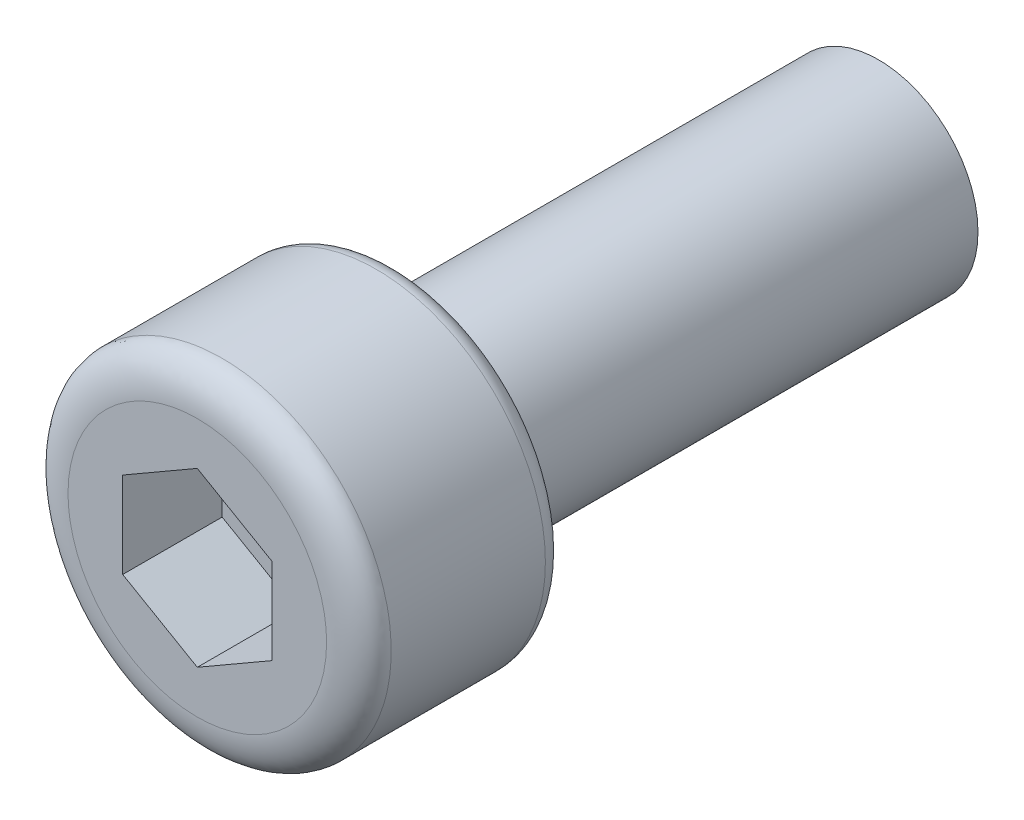
ISO-10303-21;
HEADER;
FILE_DESCRIPTION(('STEP AP214'),'2;1');
FILE_NAME('part.step','',(''),(''),'','','');
FILE_SCHEMA(('AUTOMOTIVE_DESIGN { 1 0 10303 214 1 1 1 1 }'));
ENDSEC;
DATA;
#1=APPLICATION_CONTEXT('core data for automotive mechanical design processes');
#2=APPLICATION_PROTOCOL_DEFINITION('international standard','automotive_design',2000,#1);
#3=PRODUCT_CONTEXT('',#1,'mechanical');
#4=PRODUCT('Part','Part','',(#3));
#5=PRODUCT_RELATED_PRODUCT_CATEGORY('part','',(#4));
#6=PRODUCT_DEFINITION_FORMATION('','',#4);
#7=PRODUCT_DEFINITION_CONTEXT('part definition',#1,'design');
#8=PRODUCT_DEFINITION('design','',#6,#7);
#9=PRODUCT_DEFINITION_SHAPE('','',#8);
#10=(LENGTH_UNIT() NAMED_UNIT(*) SI_UNIT(.MILLI.,.METRE.));
#11=(NAMED_UNIT(*) PLANE_ANGLE_UNIT() SI_UNIT($,.RADIAN.));
#12=(NAMED_UNIT(*) SI_UNIT($,.STERADIAN.) SOLID_ANGLE_UNIT());
#13=UNCERTAINTY_MEASURE_WITH_UNIT(LENGTH_MEASURE(1.E-05),#10,'distance_accuracy_value','');
#14=(GEOMETRIC_REPRESENTATION_CONTEXT(3) GLOBAL_UNCERTAINTY_ASSIGNED_CONTEXT((#13)) GLOBAL_UNIT_ASSIGNED_CONTEXT((#10,
#11,#12)) REPRESENTATION_CONTEXT('',''));
#15=CARTESIAN_POINT('',(0.,0.,0.));
#16=DIRECTION('',(0.,0.,1.));
#17=DIRECTION('',(1.,0.,0.));
#18=AXIS2_PLACEMENT_3D('',#15,#16,#17);
#19=CARTESIAN_POINT('',(0.,0.,7.));
#20=DIRECTION('',(0.,0.,1.));
#21=DIRECTION('',(1.,0.,0.));
#22=AXIS2_PLACEMENT_3D('',#19,#20,#21);
#23=PLANE('',#22);
#24=DIRECTION('',(-0.866025403784439,0.5,0.));
#25=VECTOR('',#24,1.);
#26=CARTESIAN_POINT('',(1.5,0.86602540378444,7.));
#27=LINE('',#26,#25);
#28=CARTESIAN_POINT('',(1.5,0.86602540378444,7.));
#29=VERTEX_POINT('',#28);
#30=CARTESIAN_POINT('',(0.,1.73205080756888,7.));
#31=VERTEX_POINT('',#30);
#32=EDGE_CURVE('E67',#29,#31,#27,.T.);
#33=ORIENTED_EDGE('',*,*,#32,.F.);
#34=DIRECTION('',(0.,1.,0.));
#35=VECTOR('',#34,1.);
#36=CARTESIAN_POINT('',(1.5,-0.866025403784439,7.));
#37=LINE('',#36,#35);
#38=CARTESIAN_POINT('',(1.5,-0.866025403784439,7.));
#39=VERTEX_POINT('',#38);
#40=EDGE_CURVE('E150',#39,#29,#37,.T.);
#41=ORIENTED_EDGE('',*,*,#40,.F.);
#42=DIRECTION('',(0.866025403784439,0.5,0.));
#43=VECTOR('',#42,1.);
#44=CARTESIAN_POINT('',(0.,-1.73205080756888,7.));
#45=LINE('',#44,#43);
#46=CARTESIAN_POINT('',(0.,-1.73205080756888,7.));
#47=VERTEX_POINT('',#46);
#48=EDGE_CURVE('E148',#47,#39,#45,.T.);
#49=ORIENTED_EDGE('',*,*,#48,.F.);
#50=DIRECTION('',(0.866025403784438,-0.5,0.));
#51=VECTOR('',#50,1.);
#52=CARTESIAN_POINT('',(-1.5,-0.866025403784438,7.));
#53=LINE('',#52,#51);
#54=CARTESIAN_POINT('',(-1.5,-0.866025403784438,7.));
#55=VERTEX_POINT('',#54);
#56=EDGE_CURVE('E115',#55,#47,#53,.T.);
#57=ORIENTED_EDGE('',*,*,#56,.F.);
#58=DIRECTION('',(0.,-1.,0.));
#59=VECTOR('',#58,1.);
#60=CARTESIAN_POINT('',(-1.5,0.866025403784439,7.));
#61=LINE('',#60,#59);
#62=CARTESIAN_POINT('',(-1.5,0.866025403784439,7.));
#63=VERTEX_POINT('',#62);
#64=EDGE_CURVE('E144',#63,#55,#61,.T.);
#65=ORIENTED_EDGE('',*,*,#64,.F.);
#66=DIRECTION('',(-0.866025403784439,-0.5,0.));
#67=VECTOR('',#66,1.);
#68=CARTESIAN_POINT('',(0.,1.73205080756888,7.));
#69=LINE('',#68,#67);
#70=EDGE_CURVE('E141',#31,#63,#69,.T.);
#71=ORIENTED_EDGE('',*,*,#70,.F.);
#72=EDGE_LOOP('',(#33,#41,#49,#57,#65,#71));
#73=FACE_BOUND('',#72,.T.);
#74=CARTESIAN_POINT('',(-2.6,0.,7.));
#75=CARTESIAN_POINT('',(-2.6,0.340339195747887,7.));
#76=CARTESIAN_POINT('',(-2.53232895612653,0.680544507086419,7.));
#77=CARTESIAN_POINT('',(-2.27184461293216,1.30940934121205,7.));
#78=CARTESIAN_POINT('',(-2.07913378430198,1.59782147786811,7.));
#79=CARTESIAN_POINT('',(-1.59782147786807,2.07913378430194,7.));
#80=CARTESIAN_POINT('',(-1.30940934121205,2.27184461293216,7.));
#81=CARTESIAN_POINT('',(-0.680544507086415,2.53232895612653,7.));
#82=CARTESIAN_POINT('',(-0.340339195747888,2.6,7.));
#83=CARTESIAN_POINT('',(0.340339195747889,2.6,7.));
#84=CARTESIAN_POINT('',(0.680544507086413,2.53232895612653,7.));
#85=CARTESIAN_POINT('',(1.30940934121205,2.27184461293216,7.));
#86=CARTESIAN_POINT('',(1.59782147786806,2.07913378430191,7.));
#87=CARTESIAN_POINT('',(2.07913378430199,1.59782147786814,7.));
#88=CARTESIAN_POINT('',(2.27184461293214,1.30940934121206,7.));
#89=CARTESIAN_POINT('',(2.53232895612655,0.680544507086404,7.));
#90=CARTESIAN_POINT('',(2.6,0.340339195748112,7.));
#91=CARTESIAN_POINT('',(2.6,-0.340339195748116,7.));
#92=CARTESIAN_POINT('',(2.53232895612663,-0.680544507086149,7.));
#93=CARTESIAN_POINT('',(2.27184461293207,-1.30940934121232,7.));
#94=CARTESIAN_POINT('',(2.07913378430184,-1.59782147786829,7.));
#95=CARTESIAN_POINT('',(1.59782147786821,-2.07913378430176,7.));
#96=CARTESIAN_POINT('',(1.30940934121224,-2.27184461293209,7.));
#97=CARTESIAN_POINT('',(0.68054450708623,-2.53232895612661,7.));
#98=CARTESIAN_POINT('',(0.340339195748087,-2.6,7.));
#99=CARTESIAN_POINT('',(-0.340339195748083,-2.6,7.));
#100=CARTESIAN_POINT('',(-0.680544507086233,-2.53232895612661,7.));
#101=CARTESIAN_POINT('',(-1.30940934121224,-2.27184461293209,7.));
#102=CARTESIAN_POINT('',(-1.59782147786814,-2.07913378430198,7.));
#103=CARTESIAN_POINT('',(-2.0791337843019,-1.59782147786808,7.));
#104=CARTESIAN_POINT('',(-2.27184461293223,-1.30940934121205,7.));
#105=CARTESIAN_POINT('',(-2.53232895612646,-0.680544507086415,7.));
#106=CARTESIAN_POINT('',(-2.6,-0.34033919574789,7.));
#107=CARTESIAN_POINT('',(-2.6,0.,7.));
#108=(BOUNDED_CURVE() B_SPLINE_CURVE(3,(#74,#75,#76,#77,#78,#79,#80,#81,#82,#83,#84,#85,#86,#87,
#88,#89,#90,#91,#92,#93,#94,#95,#96,#97,#98,#99,#100,#101,#102,#103,#104,#105,#106,#107),
.UNSPECIFIED.,.T.,.F.) B_SPLINE_CURVE_WITH_KNOTS((4,2,2,2,2,2,2,2,2,2,2,2,2,2,2,2,4),
(-3.14159265358979,-2.74889357189107,-2.35619449019234,-1.96349540849362,-1.5707963267949,
-1.17809724509617,-0.785398163397448,-0.392699081698724,0.,0.392699081698724,0.785398163397448,
1.17809724509617,1.5707963267949,1.96349540849362,2.35619449019234,2.74889357189107,
3.14159265358979),
.UNSPECIFIED.) CURVE() GEOMETRIC_REPRESENTATION_ITEM() RATIONAL_B_SPLINE_CURVE((1.,1.,1.,1.,1.,
1.,1.,1.,1.,1.,1.,1.,1.,1.,1.,1.,1.,1.,1.,1.,1.,1.,1.,1.,1.,1.,1.,1.,1.,1.,1.,1.,1.,1.)) REPRESENTATION_ITEM(''));
#109=CARTESIAN_POINT('',(-2.6,0.,7.));
#110=VERTEX_POINT('',#109);
#111=EDGE_CURVE('E13',#110,#110,#108,.F.);
#112=ORIENTED_EDGE('',*,*,#111,.T.);
#113=EDGE_LOOP('',(#112));
#114=FACE_BOUND('',#113,.T.);
#115=ADVANCED_FACE('F46',(#73,#114),#23,.T.);
#116=CARTESIAN_POINT('',(0.,0.,-7.));
#117=DIRECTION('',(0.,0.,-1.));
#118=DIRECTION('',(-1.,0.,0.));
#119=AXIS2_PLACEMENT_3D('',#116,#117,#118);
#120=CYLINDRICAL_SURFACE('',#119,3.4);
#121=CARTESIAN_POINT('',(-3.4,0.,6.5));
#122=CARTESIAN_POINT('',(-3.4,-0.445058948285702,6.5));
#123=CARTESIAN_POINT('',(-3.31150709647312,-0.889942816959202,6.5));
#124=CARTESIAN_POINT('',(-2.97087372460363,-1.7123045231234,6.5));
#125=CARTESIAN_POINT('',(-2.71886725639486,-2.08945885567367,6.5));
#126=CARTESIAN_POINT('',(-2.08945885567366,-2.71886725639486,6.5));
#127=CARTESIAN_POINT('',(-1.71230452312369,-2.97087372460351,6.5));
#128=CARTESIAN_POINT('',(-0.889942816958928,-3.31150709647324,6.5));
#129=CARTESIAN_POINT('',(-0.445058948285955,-3.4,6.5));
#130=CARTESIAN_POINT('',(0.445058948285959,-3.4,6.5));
#131=CARTESIAN_POINT('',(0.889942816958924,-3.31150709647324,6.5));
#132=CARTESIAN_POINT('',(1.71230452312369,-2.97087372460352,6.5));
#133=CARTESIAN_POINT('',(2.08945885567389,-2.71886725639464,6.5));
#134=CARTESIAN_POINT('',(2.71886725639464,-2.08945885567388,6.5));
#135=CARTESIAN_POINT('',(2.97087372460348,-1.71230452312378,6.5));
#136=CARTESIAN_POINT('',(3.31150709647328,-0.889942816958834,6.5));
#137=CARTESIAN_POINT('',(3.4,-0.445058948285998,6.5));
#138=CARTESIAN_POINT('',(3.4,0.445058948285994,6.5));
#139=CARTESIAN_POINT('',(3.31150709647316,0.889942816959108,6.5));
#140=CARTESIAN_POINT('',(2.97087372460359,1.7123045231235,6.5));
#141=CARTESIAN_POINT('',(2.71886725639482,2.0894588556737,6.5));
#142=CARTESIAN_POINT('',(2.0894588556737,2.71886725639482,6.5));
#143=CARTESIAN_POINT('',(1.71230452312347,2.9708737246036,6.5));
#144=CARTESIAN_POINT('',(0.889942816959137,3.31150709647315,6.5));
#145=CARTESIAN_POINT('',(0.4450589482857,3.4,6.5));
#146=CARTESIAN_POINT('',(-0.4450589482857,3.4,6.5));
#147=CARTESIAN_POINT('',(-0.889942816959166,3.31150709647314,6.5));
#148=CARTESIAN_POINT('',(-1.71230452312345,2.97087372460361,6.5));
#149=CARTESIAN_POINT('',(-2.08945885567363,2.71886725639489,6.5));
#150=CARTESIAN_POINT('',(-2.7188672563949,2.08945885567362,6.5));
#151=CARTESIAN_POINT('',(-2.9708737246036,1.71230452312347,6.5));
#152=CARTESIAN_POINT('',(-3.31150709647314,0.88994281695915,6.5));
#153=CARTESIAN_POINT('',(-3.4,0.445058948285699,6.5));
#154=CARTESIAN_POINT('',(-3.4,0.,6.5));
#155=(BOUNDED_CURVE() B_SPLINE_CURVE(3,(#121,#122,#123,#124,#125,#126,#127,#128,#129,#130,#131,
#132,#133,#134,#135,#136,#137,#138,#139,#140,#141,#142,#143,#144,#145,#146,#147,#148,#149,#150,
#151,#152,#153,#154),.UNSPECIFIED.,.T.,.F.) B_SPLINE_CURVE_WITH_KNOTS((4,2,2,2,2,2,2,2,2,2,2,2,
2,2,2,2,4),(-3.14159265358979,-2.74889357189107,-2.35619449019234,-1.96349540849362,
-1.5707963267949,-1.17809724509617,-0.785398163397448,-0.392699081698724,0.,0.392699081698724,
0.785398163397448,1.17809724509617,1.5707963267949,1.96349540849362,2.35619449019234,
2.74889357189107,3.14159265358979),
.UNSPECIFIED.) CURVE() GEOMETRIC_REPRESENTATION_ITEM() RATIONAL_B_SPLINE_CURVE((1.,1.,1.,1.,1.,
1.,1.,1.,1.,1.,1.,1.,1.,1.,1.,1.,1.,1.,1.,1.,1.,1.,1.,1.,1.,1.,1.,1.,1.,1.,1.,1.,1.,1.)) REPRESENTATION_ITEM(''));
#156=CARTESIAN_POINT('',(-3.4,0.,6.5));
#157=VERTEX_POINT('',#156);
#158=EDGE_CURVE('E60',#157,#157,#155,.F.);
#159=ORIENTED_EDGE('',*,*,#158,.T.);
#160=EDGE_LOOP('',(#159));
#161=FACE_BOUND('',#160,.T.);
#162=CARTESIAN_POINT('',(0.,0.,3.4));
#163=DIRECTION('',(0.,0.,-1.));
#164=DIRECTION('',(-1.,0.,0.));
#165=AXIS2_PLACEMENT_3D('',#162,#163,#164);
#166=CIRCLE('',#165,3.4);
#167=CARTESIAN_POINT('',(-3.4,0.,3.4));
#168=VERTEX_POINT('',#167);
#169=EDGE_CURVE('E171',#168,#168,#166,.F.);
#170=ORIENTED_EDGE('',*,*,#169,.T.);
#171=EDGE_LOOP('',(#170));
#172=FACE_BOUND('',#171,.T.);
#173=ADVANCED_FACE('F183',(#161,#172),#120,.T.);
#174=CARTESIAN_POINT('',(0.,3.4,3.));
#175=DIRECTION('',(0.,0.,-1.));
#176=DIRECTION('',(-1.,0.,0.));
#177=AXIS2_PLACEMENT_3D('',#174,#175,#176);
#178=PLANE('',#177);
#179=CARTESIAN_POINT('',(0.,0.,3.));
#180=DIRECTION('',(0.,0.,-1.));
#181=DIRECTION('',(-1.,0.,0.));
#182=AXIS2_PLACEMENT_3D('',#179,#180,#181);
#183=CIRCLE('',#182,3.);
#184=CARTESIAN_POINT('',(-3.,0.,3.));
#185=VERTEX_POINT('',#184);
#186=EDGE_CURVE('E168',#185,#185,#183,.T.);
#187=ORIENTED_EDGE('',*,*,#186,.T.);
#188=EDGE_LOOP('',(#187));
#189=FACE_BOUND('',#188,.T.);
#190=CARTESIAN_POINT('',(0.,0.,3.));
#191=DIRECTION('',(0.,0.,-1.));
#192=DIRECTION('',(-1.,0.,0.));
#193=AXIS2_PLACEMENT_3D('',#190,#191,#192);
#194=CIRCLE('',#193,2.);
#195=CARTESIAN_POINT('',(-2.,0.,3.));
#196=VERTEX_POINT('',#195);
#197=EDGE_CURVE('E154',#196,#196,#194,.T.);
#198=ORIENTED_EDGE('',*,*,#197,.F.);
#199=EDGE_LOOP('',(#198));
#200=FACE_BOUND('',#199,.T.);
#201=ADVANCED_FACE('F193',(#189,#200),#178,.T.);
#202=CARTESIAN_POINT('',(0.,0.,-7.));
#203=DIRECTION('',(0.,0.,-1.));
#204=DIRECTION('',(-1.,0.,0.));
#205=AXIS2_PLACEMENT_3D('',#202,#203,#204);
#206=CYLINDRICAL_SURFACE('',#205,2.);
#207=CARTESIAN_POINT('',(0.,0.,-6.7));
#208=DIRECTION('',(0.,0.,-1.));
#209=DIRECTION('',(-1.,0.,0.));
#210=AXIS2_PLACEMENT_3D('',#207,#208,#209);
#211=CIRCLE('',#210,2.);
#212=CARTESIAN_POINT('',(2.,0.,-6.7));
#213=VERTEX_POINT('',#212);
#214=EDGE_CURVE('E165',#213,#213,#211,.F.);
#215=ORIENTED_EDGE('',*,*,#214,.T.);
#216=EDGE_LOOP('',(#215));
#217=FACE_BOUND('',#216,.T.);
#218=ORIENTED_EDGE('',*,*,#197,.T.);
#219=EDGE_LOOP('',(#218));
#220=FACE_BOUND('',#219,.T.);
#221=ADVANCED_FACE('F242',(#217,#220),#206,.T.);
#222=CARTESIAN_POINT('',(0.,2.,-7.));
#223=DIRECTION('',(0.,0.,-1.));
#224=DIRECTION('',(-1.,0.,0.));
#225=AXIS2_PLACEMENT_3D('',#222,#223,#224);
#226=PLANE('',#225);
#227=CARTESIAN_POINT('',(0.,0.,-7.));
#228=DIRECTION('',(0.,0.,-1.));
#229=DIRECTION('',(-1.,0.,0.));
#230=AXIS2_PLACEMENT_3D('',#227,#228,#229);
#231=CIRCLE('',#230,1.48038475772934);
#232=CARTESIAN_POINT('',(1.48038475772934,0.,-7.));
#233=VERTEX_POINT('',#232);
#234=EDGE_CURVE('E162',#233,#233,#231,.T.);
#235=ORIENTED_EDGE('',*,*,#234,.T.);
#236=EDGE_LOOP('',(#235));
#237=FACE_BOUND('',#236,.T.);
#238=ADVANCED_FACE('F234',(#237),#226,.T.);
#239=CARTESIAN_POINT('',(0.,0.,-7.));
#240=DIRECTION('',(0.,0.,1.));
#241=DIRECTION('',(1.,0.,0.));
#242=AXIS2_PLACEMENT_3D('',#239,#240,#241);
#243=CONICAL_SURFACE('',#242,1.48038475772934,1.0471975511966);
#244=CARTESIAN_POINT('',(2.,0.,-6.7));
#245=CARTESIAN_POINT('',(1.99458734122635,0.,-6.703125));
#246=CARTESIAN_POINT('',(1.9891746824527,0.,-6.70625));
#247=CARTESIAN_POINT('',(1.97834936490539,0.,-6.7125));
#248=CARTESIAN_POINT('',(1.97293670613174,0.,-6.715625));
#249=CARTESIAN_POINT('',(1.96211138858444,0.,-6.721875));
#250=CARTESIAN_POINT('',(1.95669872981078,0.,-6.725));
#251=CARTESIAN_POINT('',(1.94587341226348,0.,-6.73125));
#252=CARTESIAN_POINT('',(1.94046075348982,0.,-6.734375));
#253=CARTESIAN_POINT('',(1.92963543594252,0.,-6.740625));
#254=CARTESIAN_POINT('',(1.92422277716887,0.,-6.74375));
#255=CARTESIAN_POINT('',(1.91339745962156,0.,-6.75));
#256=CARTESIAN_POINT('',(1.90798480084791,0.,-6.753125));
#257=CARTESIAN_POINT('',(1.8971594833006,0.,-6.759375));
#258=CARTESIAN_POINT('',(1.89174682452695,0.,-6.7625));
#259=CARTESIAN_POINT('',(1.88092150697964,0.,-6.76875));
#260=CARTESIAN_POINT('',(1.87550884820599,0.,-6.771875));
#261=CARTESIAN_POINT('',(1.86468353065869,0.,-6.778125));
#262=CARTESIAN_POINT('',(1.85927087188503,0.,-6.78125));
#263=CARTESIAN_POINT('',(1.84844555433773,0.,-6.7875));
#264=CARTESIAN_POINT('',(1.84303289556407,0.,-6.790625));
#265=CARTESIAN_POINT('',(1.83220757801677,0.,-6.796875));
#266=CARTESIAN_POINT('',(1.82679491924312,0.,-6.8));
#267=CARTESIAN_POINT('',(1.81596960169581,0.,-6.80625));
#268=CARTESIAN_POINT('',(1.81055694292216,0.,-6.809375));
#269=CARTESIAN_POINT('',(1.79973162537485,0.,-6.815625));
#270=CARTESIAN_POINT('',(1.7943189666012,0.,-6.81875));
#271=CARTESIAN_POINT('',(1.78349364905389,0.,-6.825));
#272=CARTESIAN_POINT('',(1.77808099028024,0.,-6.828125));
#273=CARTESIAN_POINT('',(1.76725567273294,0.,-6.834375));
#274=CARTESIAN_POINT('',(1.76184301395928,0.,-6.8375));
#275=CARTESIAN_POINT('',(1.75101769641198,0.,-6.84375));
#276=CARTESIAN_POINT('',(1.74560503763833,0.,-6.846875));
#277=CARTESIAN_POINT('',(1.73477972009102,0.,-6.853125));
#278=CARTESIAN_POINT('',(1.72936706131737,0.,-6.85625));
#279=CARTESIAN_POINT('',(1.71854174377006,0.,-6.8625));
#280=CARTESIAN_POINT('',(1.71312908499641,0.,-6.865625));
#281=CARTESIAN_POINT('',(1.7023037674491,0.,-6.871875));
#282=CARTESIAN_POINT('',(1.69689110867545,0.,-6.875));
#283=CARTESIAN_POINT('',(1.68606579112815,0.,-6.88125));
#284=CARTESIAN_POINT('',(1.68065313235449,0.,-6.884375));
#285=CARTESIAN_POINT('',(1.66982781480719,0.,-6.890625));
#286=CARTESIAN_POINT('',(1.66441515603353,0.,-6.89375));
#287=CARTESIAN_POINT('',(1.65358983848623,0.,-6.9));
#288=CARTESIAN_POINT('',(1.64817717971258,0.,-6.903125));
#289=CARTESIAN_POINT('',(1.63735186216527,0.,-6.909375));
#290=CARTESIAN_POINT('',(1.63193920339162,0.,-6.9125));
#291=CARTESIAN_POINT('',(1.62111388584431,0.,-6.91875));
#292=CARTESIAN_POINT('',(1.61570122707066,0.,-6.921875));
#293=CARTESIAN_POINT('',(1.60487590952335,0.,-6.928125));
#294=CARTESIAN_POINT('',(1.5994632507497,0.,-6.93125));
#295=CARTESIAN_POINT('',(1.5886379332024,0.,-6.9375));
#296=CARTESIAN_POINT('',(1.58322527442874,0.,-6.940625));
#297=CARTESIAN_POINT('',(1.57239995688144,0.,-6.946875));
#298=CARTESIAN_POINT('',(1.56698729810779,0.,-6.95));
#299=CARTESIAN_POINT('',(1.55616198056048,0.,-6.95625));
#300=CARTESIAN_POINT('',(1.55074932178683,0.,-6.959375));
#301=CARTESIAN_POINT('',(1.53992400423952,0.,-6.965625));
#302=CARTESIAN_POINT('',(1.53451134546587,0.,-6.96875));
#303=CARTESIAN_POINT('',(1.52368602791856,0.,-6.975));
#304=CARTESIAN_POINT('',(1.51827336914491,0.,-6.978125));
#305=CARTESIAN_POINT('',(1.5074480515976,0.,-6.984375));
#306=CARTESIAN_POINT('',(1.50203539282395,0.,-6.9875));
#307=CARTESIAN_POINT('',(1.49121007527665,0.,-6.99375));
#308=CARTESIAN_POINT('',(1.48579741650299,0.,-6.996875));
#309=CARTESIAN_POINT('',(1.48038475772934,0.,-7.));
#310=B_SPLINE_CURVE_WITH_KNOTS('',3,(#244,#245,#246,#247,#248,#249,#250,#251,#252,#253,#254,
#255,#256,#257,#258,#259,#260,#261,#262,#263,#264,#265,#266,#267,#268,#269,#270,#271,#272,#273,
#274,#275,#276,#277,#278,#279,#280,#281,#282,#283,#284,#285,#286,#287,#288,#289,#290,#291,#292,
#293,#294,#295,#296,#297,#298,#299,#300,#301,#302,#303,#304,#305,#306,#307,#308,#309),
.UNSPECIFIED.,.F.,.F.,(4,2,2,2,2,2,2,2,2,2,2,2,2,2,2,2,2,2,2,2,2,2,2,2,2,2,2,2,2,2,2,2,4),(0.,
0.0187500000000003,0.0374999999999998,0.0562499999999997,0.0749999999999998,0.0937500000000002,
0.1125,0.13125,0.15,0.16875,0.1875,0.20625,0.225,0.24375,0.2625,0.28125,0.3,0.31875,0.3375,
0.35625,0.375,0.39375,0.4125,0.43125,0.45,0.46875,0.4875,0.50625,0.525,0.54375,0.5625,
0.581249999999999,0.6),.UNSPECIFIED.);
#311=EDGE_CURVE('BSEAM200',#213,#233,#310,.T.);
#312=ORIENTED_EDGE('',*,*,#214,.F.);
#313=ORIENTED_EDGE('',*,*,#234,.F.);
#314=ORIENTED_EDGE('',*,*,#311,.T.);
#315=ORIENTED_EDGE('',*,*,#311,.F.);
#316=EDGE_LOOP('',(#312,#314,#313,#315));
#317=FACE_BOUND('',#316,.T.);
#318=ADVANCED_FACE('F200',(#317),#243,.T.);
#319=CARTESIAN_POINT('',(0.,0.,3.4));
#320=DIRECTION('',(0.,0.,-1.));
#321=DIRECTION('',(-1.,0.,0.));
#322=AXIS2_PLACEMENT_3D('',#319,#320,#321);
#323=TOROIDAL_SURFACE('',#322,3.,0.4);
#324=ORIENTED_EDGE('',*,*,#169,.F.);
#325=EDGE_LOOP('',(#324));
#326=FACE_BOUND('',#325,.T.);
#327=ORIENTED_EDGE('',*,*,#186,.F.);
#328=EDGE_LOOP('',(#327));
#329=FACE_BOUND('',#328,.T.);
#330=ADVANCED_FACE('F223',(#326,#329),#323,.T.);
#331=CARTESIAN_POINT('',(-2.6,0.,7.));
#332=CARTESIAN_POINT('',(-2.6,-0.34033919574789,7.));
#333=CARTESIAN_POINT('',(-2.53232895612646,-0.680544507086415,7.));
#334=CARTESIAN_POINT('',(-2.27184461293223,-1.30940934121205,7.));
#335=CARTESIAN_POINT('',(-2.0791337843019,-1.59782147786808,7.));
#336=CARTESIAN_POINT('',(-1.59782147786814,-2.07913378430198,7.));
#337=CARTESIAN_POINT('',(-1.30940934121224,-2.27184461293209,7.));
#338=CARTESIAN_POINT('',(-0.680544507086233,-2.53232895612661,7.));
#339=CARTESIAN_POINT('',(-0.340339195748083,-2.6,7.));
#340=CARTESIAN_POINT('',(0.340339195748087,-2.6,7.));
#341=CARTESIAN_POINT('',(0.68054450708623,-2.53232895612661,7.));
#342=CARTESIAN_POINT('',(1.30940934121224,-2.27184461293209,7.));
#343=CARTESIAN_POINT('',(1.59782147786821,-2.07913378430176,7.));
#344=CARTESIAN_POINT('',(2.07913378430184,-1.59782147786829,7.));
#345=CARTESIAN_POINT('',(2.27184461293207,-1.30940934121232,7.));
#346=CARTESIAN_POINT('',(2.53232895612663,-0.680544507086149,7.));
#347=CARTESIAN_POINT('',(2.6,-0.340339195748116,7.));
#348=CARTESIAN_POINT('',(2.6,0.340339195748112,7.));
#349=CARTESIAN_POINT('',(2.53232895612655,0.680544507086404,7.));
#350=CARTESIAN_POINT('',(2.27184461293214,1.30940934121206,7.));
#351=CARTESIAN_POINT('',(2.07913378430199,1.59782147786814,7.));
#352=CARTESIAN_POINT('',(1.59782147786806,2.07913378430191,7.));
#353=CARTESIAN_POINT('',(1.30940934121205,2.27184461293216,7.));
#354=CARTESIAN_POINT('',(0.680544507086413,2.53232895612653,7.));
#355=CARTESIAN_POINT('',(0.340339195747889,2.6,7.));
#356=CARTESIAN_POINT('',(-0.340339195747888,2.6,7.));
#357=CARTESIAN_POINT('',(-0.680544507086415,2.53232895612653,7.));
#358=CARTESIAN_POINT('',(-1.30940934121205,2.27184461293216,7.));
#359=CARTESIAN_POINT('',(-1.59782147786807,2.07913378430194,7.));
#360=CARTESIAN_POINT('',(-2.07913378430198,1.59782147786811,7.));
#361=CARTESIAN_POINT('',(-2.27184461293216,1.30940934121205,7.));
#362=CARTESIAN_POINT('',(-2.53232895612653,0.680544507086419,7.));
#363=CARTESIAN_POINT('',(-2.6,0.340339195747887,7.));
#364=CARTESIAN_POINT('',(-2.6,0.,7.));
#365=CARTESIAN_POINT('',(-3.4,0.,7.));
#366=CARTESIAN_POINT('',(-3.4,-0.445058948285702,7.));
#367=CARTESIAN_POINT('',(-3.31150709647311,-0.889942816959197,7.));
#368=CARTESIAN_POINT('',(-2.97087372460364,-1.71230452312341,7.));
#369=CARTESIAN_POINT('',(-2.71886725639478,-2.0894588556736,7.));
#370=CARTESIAN_POINT('',(-2.08945885567374,-2.71886725639494,7.));
#371=CARTESIAN_POINT('',(-1.7123045231237,-2.97087372460352,7.));
#372=CARTESIAN_POINT('',(-0.889942816958926,-3.31150709647323,7.));
#373=CARTESIAN_POINT('',(-0.445058948285955,-3.4,7.));
#374=CARTESIAN_POINT('',(0.445058948285959,-3.4,7.));
#375=CARTESIAN_POINT('',(0.889942816958922,-3.31150709647324,7.));
#376=CARTESIAN_POINT('',(1.71230452312369,-2.97087372460352,7.));
#377=CARTESIAN_POINT('',(2.08945885567385,-2.7188672563946,7.));
#378=CARTESIAN_POINT('',(2.71886725639468,-2.08945885567392,7.));
#379=CARTESIAN_POINT('',(2.9708737246035,-1.71230452312379,7.));
#380=CARTESIAN_POINT('',(3.31150709647326,-0.889942816958826,7.));
#381=CARTESIAN_POINT('',(3.4,-0.445058948285998,7.));
#382=CARTESIAN_POINT('',(3.4,0.445058948285994,7.));
#383=CARTESIAN_POINT('',(3.31150709647318,0.889942816959118,7.));
#384=CARTESIAN_POINT('',(2.97087372460357,1.71230452312349,7.));
#385=CARTESIAN_POINT('',(2.71886725639475,2.0894588556737,7.));
#386=CARTESIAN_POINT('',(2.08945885567377,2.71886725639482,7.));
#387=CARTESIAN_POINT('',(1.71230452312347,2.97087372460359,7.));
#388=CARTESIAN_POINT('',(0.889942816959141,3.31150709647316,7.));
#389=CARTESIAN_POINT('',(0.4450589482857,3.4,7.));
#390=CARTESIAN_POINT('',(-0.4450589482857,3.4,7.));
#391=CARTESIAN_POINT('',(-0.889942816959144,3.31150709647308,7.));
#392=CARTESIAN_POINT('',(-1.71230452312347,2.97087372460366,7.));
#393=CARTESIAN_POINT('',(-2.08945885567367,2.71886725639493,7.));
#394=CARTESIAN_POINT('',(-2.71886725639486,2.08945885567359,7.));
#395=CARTESIAN_POINT('',(-2.97087372460357,1.71230452312345,7.));
#396=CARTESIAN_POINT('',(-3.31150709647318,0.889942816959166,7.));
#397=CARTESIAN_POINT('',(-3.4,0.445058948285699,7.));
#398=CARTESIAN_POINT('',(-3.4,0.,7.));
#399=CARTESIAN_POINT('',(-3.4,0.,6.5));
#400=CARTESIAN_POINT('',(-3.4,-0.445058948285702,6.5));
#401=CARTESIAN_POINT('',(-3.31150709647312,-0.889942816959202,6.5));
#402=CARTESIAN_POINT('',(-2.97087372460363,-1.7123045231234,6.5));
#403=CARTESIAN_POINT('',(-2.71886725639486,-2.08945885567367,6.5));
#404=CARTESIAN_POINT('',(-2.08945885567366,-2.71886725639486,6.5));
#405=CARTESIAN_POINT('',(-1.71230452312369,-2.97087372460351,6.5));
#406=CARTESIAN_POINT('',(-0.889942816958928,-3.31150709647324,6.5));
#407=CARTESIAN_POINT('',(-0.445058948285955,-3.4,6.5));
#408=CARTESIAN_POINT('',(0.445058948285959,-3.4,6.5));
#409=CARTESIAN_POINT('',(0.889942816958924,-3.31150709647324,6.5));
#410=CARTESIAN_POINT('',(1.71230452312369,-2.97087372460352,6.5));
#411=CARTESIAN_POINT('',(2.08945885567389,-2.71886725639464,6.5));
#412=CARTESIAN_POINT('',(2.71886725639464,-2.08945885567388,6.5));
#413=CARTESIAN_POINT('',(2.97087372460348,-1.71230452312378,6.5));
#414=CARTESIAN_POINT('',(3.31150709647328,-0.889942816958834,6.5));
#415=CARTESIAN_POINT('',(3.4,-0.445058948285998,6.5));
#416=CARTESIAN_POINT('',(3.4,0.445058948285994,6.5));
#417=CARTESIAN_POINT('',(3.31150709647316,0.889942816959108,6.5));
#418=CARTESIAN_POINT('',(2.97087372460359,1.7123045231235,6.5));
#419=CARTESIAN_POINT('',(2.71886725639482,2.0894588556737,6.5));
#420=CARTESIAN_POINT('',(2.0894588556737,2.71886725639482,6.5));
#421=CARTESIAN_POINT('',(1.71230452312347,2.9708737246036,6.5));
#422=CARTESIAN_POINT('',(0.889942816959137,3.31150709647315,6.5));
#423=CARTESIAN_POINT('',(0.4450589482857,3.4,6.5));
#424=CARTESIAN_POINT('',(-0.4450589482857,3.4,6.5));
#425=CARTESIAN_POINT('',(-0.889942816959166,3.31150709647314,6.5));
#426=CARTESIAN_POINT('',(-1.71230452312345,2.97087372460361,6.5));
#427=CARTESIAN_POINT('',(-2.08945885567363,2.71886725639489,6.5));
#428=CARTESIAN_POINT('',(-2.7188672563949,2.08945885567362,6.5));
#429=CARTESIAN_POINT('',(-2.9708737246036,1.71230452312347,6.5));
#430=CARTESIAN_POINT('',(-3.31150709647314,0.88994281695915,6.5));
#431=CARTESIAN_POINT('',(-3.4,0.445058948285699,6.5));
#432=CARTESIAN_POINT('',(-3.4,0.,6.5));
#433=(BOUNDED_SURFACE() B_SPLINE_SURFACE(2,3,((#331,#332,#333,#334,#335,#336,#337,#338,#339,
#340,#341,#342,#343,#344,#345,#346,#347,#348,#349,#350,#351,#352,#353,#354,#355,#356,#357,#358,
#359,#360,#361,#362,#363,#364),(#365,#366,#367,#368,#369,#370,#371,#372,#373,#374,#375,#376,
#377,#378,#379,#380,#381,#382,#383,#384,#385,#386,#387,#388,#389,#390,#391,#392,#393,#394,#395,
#396,#397,#398),(#399,#400,#401,#402,#403,#404,#405,#406,#407,#408,#409,#410,#411,#412,#413,
#414,#415,#416,#417,#418,#419,#420,#421,#422,#423,#424,#425,#426,#427,#428,#429,#430,#431,
#432)),.UNSPECIFIED.,.F.,.T.,.F.) B_SPLINE_SURFACE_WITH_KNOTS((3,3),(4,2,2,2,2,2,2,2,2,2,2,2,2,
2,2,2,4),(0.,1.),(-3.14159265358979,-2.74889357189107,-2.35619449019234,-1.96349540849362,
-1.5707963267949,-1.17809724509617,-0.785398163397448,-0.392699081698724,0.,0.392699081698724,
0.785398163397448,1.17809724509617,1.5707963267949,1.96349540849362,2.35619449019234,
2.74889357189107,3.14159265358979),
.UNSPECIFIED.) GEOMETRIC_REPRESENTATION_ITEM() RATIONAL_B_SPLINE_SURFACE(((1.,1.,1.,1.,1.,1.,1.,
1.,1.,1.,1.,1.,1.,1.,1.,1.,1.,1.,1.,1.,1.,1.,1.,1.,1.,1.,1.,1.,1.,1.,1.,1.,1.,1.),
(0.707106781186548,0.707106781186548,0.707106781186548,0.707106781186548,0.707106781186547,
0.707106781186547,0.707106781186548,0.707106781186548,0.707106781186548,0.707106781186548,
0.707106781186548,0.707106781186548,0.707106781186548,0.707106781186548,0.707106781186548,
0.707106781186548,0.707106781186548,0.707106781186548,0.707106781186548,0.707106781186548,
0.707106781186548,0.707106781186548,0.707106781186548,0.707106781186548,0.707106781186548,
0.707106781186548,0.707106781186548,0.707106781186548,0.707106781186548,0.707106781186548,
0.707106781186548,0.707106781186548,0.707106781186548,0.707106781186548),(1.,1.,1.,1.,1.,1.,1.,
1.,1.,1.,1.,1.,1.,1.,1.,1.,1.,1.,1.,1.,1.,1.,1.,1.,1.,1.,1.,1.,1.,1.,1.,1.,1.,1.))) REPRESENTATION_ITEM('') SURFACE());
#434=ORIENTED_EDGE('',*,*,#111,.F.);
#435=EDGE_LOOP('',(#434));
#436=FACE_BOUND('',#435,.T.);
#437=ORIENTED_EDGE('',*,*,#158,.F.);
#438=EDGE_LOOP('',(#437));
#439=FACE_BOUND('',#438,.T.);
#440=ADVANCED_FACE('F49',(#436,#439),#433,.T.);
#441=CARTESIAN_POINT('',(1.5,0.86602540378444,5.));
#442=DIRECTION('',(0.5,0.866025403784439,0.));
#443=DIRECTION('',(-0.866025403784439,0.5,0.));
#444=AXIS2_PLACEMENT_3D('',#441,#442,#443);
#445=PLANE('',#444);
#446=ORIENTED_EDGE('',*,*,#32,.T.);
#447=DIRECTION('',(0.,0.,1.));
#448=VECTOR('',#447,1.);
#449=CARTESIAN_POINT('',(0.,1.73205080756888,5.));
#450=LINE('',#449,#448);
#451=CARTESIAN_POINT('',(0.,1.73205080756888,5.));
#452=VERTEX_POINT('',#451);
#453=EDGE_CURVE('E97',#452,#31,#450,.T.);
#454=ORIENTED_EDGE('',*,*,#453,.F.);
#455=DIRECTION('',(-0.866025403784439,0.5,0.));
#456=VECTOR('',#455,1.);
#457=CARTESIAN_POINT('',(1.5,0.86602540378444,5.));
#458=LINE('',#457,#456);
#459=CARTESIAN_POINT('',(1.5,0.86602540378444,5.));
#460=VERTEX_POINT('',#459);
#461=EDGE_CURVE('E152',#460,#452,#458,.T.);
#462=ORIENTED_EDGE('',*,*,#461,.F.);
#463=DIRECTION('',(0.,0.,1.));
#464=VECTOR('',#463,1.);
#465=CARTESIAN_POINT('',(1.5,0.86602540378444,5.));
#466=LINE('',#465,#464);
#467=EDGE_CURVE('E75',#460,#29,#466,.T.);
#468=ORIENTED_EDGE('',*,*,#467,.T.);
#469=EDGE_LOOP('',(#446,#454,#462,#468));
#470=FACE_BOUND('',#469,.T.);
#471=ADVANCED_FACE('F222',(#470),#445,.F.);
#472=CARTESIAN_POINT('',(1.5,-0.866025403784439,5.));
#473=DIRECTION('',(1.,0.,0.));
#474=DIRECTION('',(0.,0.,-1.));
#475=AXIS2_PLACEMENT_3D('',#472,#473,#474);
#476=PLANE('',#475);
#477=ORIENTED_EDGE('',*,*,#40,.T.);
#478=ORIENTED_EDGE('',*,*,#467,.F.);
#479=DIRECTION('',(0.,1.,0.));
#480=VECTOR('',#479,1.);
#481=CARTESIAN_POINT('',(1.5,-0.866025403784439,5.));
#482=LINE('',#481,#480);
#483=CARTESIAN_POINT('',(1.5,-0.866025403784439,5.));
#484=VERTEX_POINT('',#483);
#485=EDGE_CURVE('E127',#484,#460,#482,.T.);
#486=ORIENTED_EDGE('',*,*,#485,.F.);
#487=DIRECTION('',(0.,0.,1.));
#488=VECTOR('',#487,1.);
#489=CARTESIAN_POINT('',(1.5,-0.866025403784439,5.));
#490=LINE('',#489,#488);
#491=EDGE_CURVE('E119',#484,#39,#490,.T.);
#492=ORIENTED_EDGE('',*,*,#491,.T.);
#493=EDGE_LOOP('',(#477,#478,#486,#492));
#494=FACE_BOUND('',#493,.T.);
#495=ADVANCED_FACE('F228',(#494),#476,.F.);
#496=CARTESIAN_POINT('',(0.,-1.73205080756888,5.));
#497=DIRECTION('',(0.5,-0.866025403784439,0.));
#498=DIRECTION('',(0.866025403784439,0.5,0.));
#499=AXIS2_PLACEMENT_3D('',#496,#497,#498);
#500=PLANE('',#499);
#501=ORIENTED_EDGE('',*,*,#48,.T.);
#502=ORIENTED_EDGE('',*,*,#491,.F.);
#503=DIRECTION('',(0.866025403784439,0.5,0.));
#504=VECTOR('',#503,1.);
#505=CARTESIAN_POINT('',(0.,-1.73205080756888,5.));
#506=LINE('',#505,#504);
#507=CARTESIAN_POINT('',(0.,-1.73205080756888,5.));
#508=VERTEX_POINT('',#507);
#509=EDGE_CURVE('E123',#508,#484,#506,.T.);
#510=ORIENTED_EDGE('',*,*,#509,.F.);
#511=DIRECTION('',(0.,0.,1.));
#512=VECTOR('',#511,1.);
#513=CARTESIAN_POINT('',(0.,-1.73205080756888,5.));
#514=LINE('',#513,#512);
#515=EDGE_CURVE('E108',#508,#47,#514,.T.);
#516=ORIENTED_EDGE('',*,*,#515,.T.);
#517=EDGE_LOOP('',(#501,#502,#510,#516));
#518=FACE_BOUND('',#517,.T.);
#519=ADVANCED_FACE('F124',(#518),#500,.F.);
#520=CARTESIAN_POINT('',(-1.5,-0.866025403784438,5.));
#521=DIRECTION('',(-0.5,-0.866025403784439,0.));
#522=DIRECTION('',(0.866025403784439,-0.5,0.));
#523=AXIS2_PLACEMENT_3D('',#520,#521,#522);
#524=PLANE('',#523);
#525=ORIENTED_EDGE('',*,*,#56,.T.);
#526=ORIENTED_EDGE('',*,*,#515,.F.);
#527=DIRECTION('',(0.866025403784438,-0.5,0.));
#528=VECTOR('',#527,1.);
#529=CARTESIAN_POINT('',(-1.5,-0.866025403784438,5.));
#530=LINE('',#529,#528);
#531=CARTESIAN_POINT('',(-1.5,-0.866025403784438,5.));
#532=VERTEX_POINT('',#531);
#533=EDGE_CURVE('E112',#532,#508,#530,.T.);
#534=ORIENTED_EDGE('',*,*,#533,.F.);
#535=DIRECTION('',(0.,0.,1.));
#536=VECTOR('',#535,1.);
#537=CARTESIAN_POINT('',(-1.5,-0.866025403784438,5.));
#538=LINE('',#537,#536);
#539=EDGE_CURVE('E120',#532,#55,#538,.T.);
#540=ORIENTED_EDGE('',*,*,#539,.T.);
#541=EDGE_LOOP('',(#525,#526,#534,#540));
#542=FACE_BOUND('',#541,.T.);
#543=ADVANCED_FACE('F110',(#542),#524,.F.);
#544=CARTESIAN_POINT('',(-1.5,0.866025403784439,5.));
#545=DIRECTION('',(-1.,0.,0.));
#546=DIRECTION('',(0.,0.,1.));
#547=AXIS2_PLACEMENT_3D('',#544,#545,#546);
#548=PLANE('',#547);
#549=ORIENTED_EDGE('',*,*,#64,.T.);
#550=ORIENTED_EDGE('',*,*,#539,.F.);
#551=DIRECTION('',(0.,-1.,0.));
#552=VECTOR('',#551,1.);
#553=CARTESIAN_POINT('',(-1.5,0.866025403784439,5.));
#554=LINE('',#553,#552);
#555=CARTESIAN_POINT('',(-1.5,0.866025403784439,5.));
#556=VERTEX_POINT('',#555);
#557=EDGE_CURVE('E133',#556,#532,#554,.T.);
#558=ORIENTED_EDGE('',*,*,#557,.F.);
#559=DIRECTION('',(0.,0.,1.));
#560=VECTOR('',#559,1.);
#561=CARTESIAN_POINT('',(-1.5,0.866025403784439,5.));
#562=LINE('',#561,#560);
#563=EDGE_CURVE('E157',#556,#63,#562,.T.);
#564=ORIENTED_EDGE('',*,*,#563,.T.);
#565=EDGE_LOOP('',(#549,#550,#558,#564));
#566=FACE_BOUND('',#565,.T.);
#567=ADVANCED_FACE('F256',(#566),#548,.F.);
#568=CARTESIAN_POINT('',(0.,1.73205080756888,5.));
#569=DIRECTION('',(-0.5,0.866025403784439,0.));
#570=DIRECTION('',(-0.866025403784439,-0.5,0.));
#571=AXIS2_PLACEMENT_3D('',#568,#569,#570);
#572=PLANE('',#571);
#573=ORIENTED_EDGE('',*,*,#70,.T.);
#574=ORIENTED_EDGE('',*,*,#563,.F.);
#575=DIRECTION('',(-0.866025403784439,-0.5,0.));
#576=VECTOR('',#575,1.);
#577=CARTESIAN_POINT('',(0.,1.73205080756888,5.));
#578=LINE('',#577,#576);
#579=EDGE_CURVE('E135',#452,#556,#578,.T.);
#580=ORIENTED_EDGE('',*,*,#579,.F.);
#581=ORIENTED_EDGE('',*,*,#453,.T.);
#582=EDGE_LOOP('',(#573,#574,#580,#581));
#583=FACE_BOUND('',#582,.T.);
#584=ADVANCED_FACE('F253',(#583),#572,.F.);
#585=CARTESIAN_POINT('',(0.,0.,5.));
#586=DIRECTION('',(0.,0.,1.));
#587=DIRECTION('',(1.,0.,0.));
#588=AXIS2_PLACEMENT_3D('',#585,#586,#587);
#589=PLANE('',#588);
#590=ORIENTED_EDGE('',*,*,#461,.T.);
#591=ORIENTED_EDGE('',*,*,#579,.T.);
#592=ORIENTED_EDGE('',*,*,#557,.T.);
#593=ORIENTED_EDGE('',*,*,#533,.T.);
#594=ORIENTED_EDGE('',*,*,#509,.T.);
#595=ORIENTED_EDGE('',*,*,#485,.T.);
#596=EDGE_LOOP('',(#590,#591,#592,#593,#594,#595));
#597=FACE_BOUND('',#596,.T.);
#598=ADVANCED_FACE('F130',(#597),#589,.T.);
#599=CLOSED_SHELL('',(#115,#173,#201,#221,#238,#318,#330,#440,#471,#495,#519,#543,#567,#584,#598));
#600=MANIFOLD_SOLID_BREP('B2',#599);
#601=ADVANCED_BREP_SHAPE_REPRESENTATION('',(#18,#600),#14);
#602=SHAPE_DEFINITION_REPRESENTATION(#9,#601);
ENDSEC;
END-ISO-10303-21;
